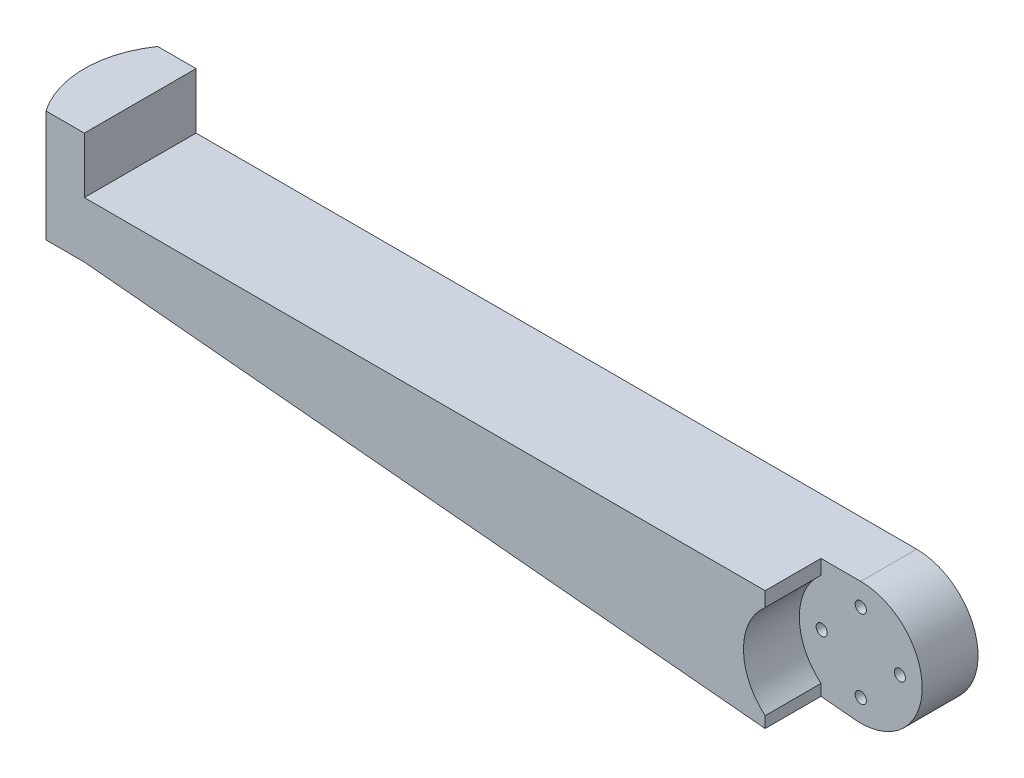
ISO-10303-21;
HEADER;
FILE_DESCRIPTION(('STEP AP214'),'2;1');
FILE_NAME('part.step','',(''),(''),'','','');
FILE_SCHEMA(('AUTOMOTIVE_DESIGN { 1 0 10303 214 1 1 1 1 }'));
ENDSEC;
DATA;
#1=APPLICATION_CONTEXT('core data for automotive mechanical design processes');
#2=APPLICATION_PROTOCOL_DEFINITION('international standard','automotive_design',2000,#1);
#3=PRODUCT_CONTEXT('',#1,'mechanical');
#4=PRODUCT('Part','Part','',(#3));
#5=PRODUCT_RELATED_PRODUCT_CATEGORY('part','',(#4));
#6=PRODUCT_DEFINITION_FORMATION('','',#4);
#7=PRODUCT_DEFINITION_CONTEXT('part definition',#1,'design');
#8=PRODUCT_DEFINITION('design','',#6,#7);
#9=PRODUCT_DEFINITION_SHAPE('','',#8);
#10=(LENGTH_UNIT() NAMED_UNIT(*) SI_UNIT(.MILLI.,.METRE.));
#11=(NAMED_UNIT(*) PLANE_ANGLE_UNIT() SI_UNIT($,.RADIAN.));
#12=(NAMED_UNIT(*) SI_UNIT($,.STERADIAN.) SOLID_ANGLE_UNIT());
#13=UNCERTAINTY_MEASURE_WITH_UNIT(LENGTH_MEASURE(1.E-05),#10,'distance_accuracy_value','');
#14=(GEOMETRIC_REPRESENTATION_CONTEXT(3) GLOBAL_UNCERTAINTY_ASSIGNED_CONTEXT((#13)) GLOBAL_UNIT_ASSIGNED_CONTEXT((#10,
#11,#12)) REPRESENTATION_CONTEXT('',''));
#15=CARTESIAN_POINT('',(0.,0.,0.));
#16=DIRECTION('',(0.,0.,1.));
#17=DIRECTION('',(1.,0.,0.));
#18=AXIS2_PLACEMENT_3D('',#15,#16,#17);
#19=CARTESIAN_POINT('',(-139.,0.999999999999987,10.));
#20=DIRECTION('',(0.,-1.,0.));
#21=DIRECTION('',(0.,0.,1.));
#22=AXIS2_PLACEMENT_3D('',#19,#20,#21);
#23=PLANE('',#22);
#24=DIRECTION('',(1.,0.,0.));
#25=VECTOR('',#24,1.);
#26=CARTESIAN_POINT('',(-139.,0.999999999999987,-10.));
#27=LINE('',#26,#25);
#28=CARTESIAN_POINT('',(-135.861406616345,0.999999999999987,-10.));
#29=VERTEX_POINT('',#28);
#30=CARTESIAN_POINT('',(-129.,0.999999999999987,-10.));
#31=VERTEX_POINT('',#30);
#32=EDGE_CURVE('E136',#29,#31,#27,.T.);
#33=ORIENTED_EDGE('',*,*,#32,.T.);
#34=DIRECTION('',(0.,0.,-1.));
#35=VECTOR('',#34,1.);
#36=CARTESIAN_POINT('',(-129.,0.999999999999987,10.));
#37=LINE('',#36,#35);
#38=CARTESIAN_POINT('',(-129.,0.999999999999987,10.));
#39=VERTEX_POINT('',#38);
#40=EDGE_CURVE('E153',#39,#31,#37,.T.);
#41=ORIENTED_EDGE('',*,*,#40,.F.);
#42=DIRECTION('',(1.,0.,0.));
#43=VECTOR('',#42,1.);
#44=CARTESIAN_POINT('',(-139.,0.999999999999987,10.));
#45=LINE('',#44,#43);
#46=CARTESIAN_POINT('',(-135.861406616345,0.999999999999987,10.));
#47=VERTEX_POINT('',#46);
#48=EDGE_CURVE('E138',#47,#39,#45,.T.);
#49=ORIENTED_EDGE('',*,*,#48,.F.);
#50=CARTESIAN_POINT('',(-121.5,0.999999999999987,0.));
#51=DIRECTION('',(0.,1.,0.));
#52=DIRECTION('',(0.,0.,1.));
#53=AXIS2_PLACEMENT_3D('',#50,#51,#52);
#54=CIRCLE('',#53,17.5);
#55=EDGE_CURVE('E124',#29,#47,#54,.T.);
#56=ORIENTED_EDGE('',*,*,#55,.F.);
#57=EDGE_LOOP('',(#33,#41,#49,#56));
#58=FACE_BOUND('',#57,.T.);
#59=ADVANCED_FACE('F41',(#58),#23,.T.);
#60=CARTESIAN_POINT('',(-129.,21.,10.));
#61=DIRECTION('',(0.,1.,0.));
#62=DIRECTION('',(-1.,0.,0.));
#63=AXIS2_PLACEMENT_3D('',#60,#61,#62);
#64=PLANE('',#63);
#65=CARTESIAN_POINT('',(-121.5,21.,0.));
#66=DIRECTION('',(0.,1.,0.));
#67=DIRECTION('',(-1.,0.,0.));
#68=AXIS2_PLACEMENT_3D('',#65,#66,#67);
#69=CIRCLE('',#68,17.5);
#70=CARTESIAN_POINT('',(-135.861406616345,21.,-10.));
#71=VERTEX_POINT('',#70);
#72=CARTESIAN_POINT('',(-135.861406616345,21.,10.));
#73=VERTEX_POINT('',#72);
#74=EDGE_CURVE('E127',#71,#73,#69,.T.);
#75=ORIENTED_EDGE('',*,*,#74,.T.);
#76=DIRECTION('',(-1.,0.,0.));
#77=VECTOR('',#76,1.);
#78=CARTESIAN_POINT('',(-129.,21.,10.));
#79=LINE('',#78,#77);
#80=CARTESIAN_POINT('',(-129.,21.,10.));
#81=VERTEX_POINT('',#80);
#82=EDGE_CURVE('E242',#81,#73,#79,.T.);
#83=ORIENTED_EDGE('',*,*,#82,.F.);
#84=DIRECTION('',(0.,0.,-1.));
#85=VECTOR('',#84,1.);
#86=CARTESIAN_POINT('',(-129.,21.,10.));
#87=LINE('',#86,#85);
#88=CARTESIAN_POINT('',(-129.,21.,-10.));
#89=VERTEX_POINT('',#88);
#90=EDGE_CURVE('E156',#81,#89,#87,.T.);
#91=ORIENTED_EDGE('',*,*,#90,.T.);
#92=DIRECTION('',(-1.,0.,0.));
#93=VECTOR('',#92,1.);
#94=CARTESIAN_POINT('',(-129.,21.,-10.));
#95=LINE('',#94,#93);
#96=EDGE_CURVE('E145',#89,#71,#95,.T.);
#97=ORIENTED_EDGE('',*,*,#96,.T.);
#98=EDGE_LOOP('',(#75,#83,#91,#97));
#99=FACE_BOUND('',#98,.T.);
#100=ADVANCED_FACE('F254',(#99),#64,.T.);
#101=CARTESIAN_POINT('',(0.,0.,-10.));
#102=DIRECTION('',(0.,0.,-1.));
#103=DIRECTION('',(1.,0.,0.));
#104=AXIS2_PLACEMENT_3D('',#101,#102,#103);
#105=PLANE('',#104);
#106=CARTESIAN_POINT('',(0.,-7.,-10.));
#107=DIRECTION('',(0.,0.,1.));
#108=DIRECTION('',(1.,0.,0.));
#109=AXIS2_PLACEMENT_3D('',#106,#107,#108);
#110=CIRCLE('',#109,1.);
#111=CARTESIAN_POINT('',(0.999999999999951,-7.,-10.));
#112=VERTEX_POINT('',#111);
#113=EDGE_CURVE('E168',#112,#112,#110,.T.);
#114=ORIENTED_EDGE('',*,*,#113,.T.);
#115=EDGE_LOOP('',(#114));
#116=FACE_BOUND('',#115,.T.);
#117=CARTESIAN_POINT('',(0.,7.,-10.));
#118=DIRECTION('',(0.,0.,1.));
#119=DIRECTION('',(1.,0.,0.));
#120=AXIS2_PLACEMENT_3D('',#117,#118,#119);
#121=CIRCLE('',#120,1.);
#122=CARTESIAN_POINT('',(1.,7.,-10.));
#123=VERTEX_POINT('',#122);
#124=EDGE_CURVE('E180',#123,#123,#121,.T.);
#125=ORIENTED_EDGE('',*,*,#124,.T.);
#126=EDGE_LOOP('',(#125));
#127=FACE_BOUND('',#126,.T.);
#128=CARTESIAN_POINT('',(7.,0.,-10.));
#129=DIRECTION('',(0.,0.,1.));
#130=DIRECTION('',(1.,0.,0.));
#131=AXIS2_PLACEMENT_3D('',#128,#129,#130);
#132=CIRCLE('',#131,1.);
#133=CARTESIAN_POINT('',(8.,0.,-10.));
#134=VERTEX_POINT('',#133);
#135=EDGE_CURVE('E174',#134,#134,#132,.T.);
#136=ORIENTED_EDGE('',*,*,#135,.T.);
#137=EDGE_LOOP('',(#136));
#138=FACE_BOUND('',#137,.T.);
#139=CARTESIAN_POINT('',(-7.,0.,-10.));
#140=DIRECTION('',(0.,0.,1.));
#141=DIRECTION('',(1.,0.,0.));
#142=AXIS2_PLACEMENT_3D('',#139,#140,#141);
#143=CIRCLE('',#142,1.);
#144=CARTESIAN_POINT('',(-6.,0.,-10.));
#145=VERTEX_POINT('',#144);
#146=EDGE_CURVE('E162',#145,#145,#143,.T.);
#147=ORIENTED_EDGE('',*,*,#146,.T.);
#148=EDGE_LOOP('',(#147));
#149=FACE_BOUND('',#148,.T.);
#150=ORIENTED_EDGE('',*,*,#96,.F.);
#151=DIRECTION('',(0.,1.,0.));
#152=VECTOR('',#151,1.);
#153=CARTESIAN_POINT('',(-129.,11.,-10.));
#154=LINE('',#153,#152);
#155=CARTESIAN_POINT('',(-129.,11.,-10.));
#156=VERTEX_POINT('',#155);
#157=EDGE_CURVE('E149',#156,#89,#154,.T.);
#158=ORIENTED_EDGE('',*,*,#157,.F.);
#159=DIRECTION('',(-1.,0.,0.));
#160=VECTOR('',#159,1.);
#161=CARTESIAN_POINT('',(0.,11.,-10.));
#162=LINE('',#161,#160);
#163=CARTESIAN_POINT('',(0.,11.,-10.));
#164=VERTEX_POINT('',#163);
#165=EDGE_CURVE('E228',#164,#156,#162,.T.);
#166=ORIENTED_EDGE('',*,*,#165,.F.);
#167=CARTESIAN_POINT('',(0.,0.,-10.));
#168=DIRECTION('',(0.,0.,1.));
#169=DIRECTION('',(1.,0.,0.));
#170=AXIS2_PLACEMENT_3D('',#167,#168,#169);
#171=CIRCLE('',#170,11.);
#172=CARTESIAN_POINT('',(-1.02288633962367,-10.9523378114543,-10.));
#173=VERTEX_POINT('',#172);
#174=EDGE_CURVE('E186',#173,#164,#171,.T.);
#175=ORIENTED_EDGE('',*,*,#174,.F.);
#176=DIRECTION('',(0.995667073768571,-0.092989667238516,0.));
#177=VECTOR('',#176,1.);
#178=CARTESIAN_POINT('',(-129.,0.999999999999987,-10.));
#179=LINE('',#178,#177);
#180=EDGE_CURVE('E143',#31,#173,#179,.T.);
#181=ORIENTED_EDGE('',*,*,#180,.F.);
#182=ORIENTED_EDGE('',*,*,#32,.F.);
#183=DIRECTION('',(0.,1.,0.));
#184=VECTOR('',#183,1.);
#185=CARTESIAN_POINT('',(-135.861406616345,-9.48097173109072,-10.));
#186=LINE('',#185,#184);
#187=EDGE_CURVE('E121',#29,#71,#186,.T.);
#188=ORIENTED_EDGE('',*,*,#187,.T.);
#189=EDGE_LOOP('',(#150,#158,#166,#175,#181,#182,#188));
#190=FACE_BOUND('',#189,.T.);
#191=ADVANCED_FACE('F140',(#116,#127,#138,#149,#190),#105,.T.);
#192=CARTESIAN_POINT('',(0.,0.,0.));
#193=DIRECTION('',(0.,0.,-1.));
#194=DIRECTION('',(1.,0.,0.));
#195=AXIS2_PLACEMENT_3D('',#192,#193,#194);
#196=PLANE('',#195);
#197=CARTESIAN_POINT('',(0.,0.,0.));
#198=DIRECTION('',(0.,0.,1.));
#199=DIRECTION('',(1.,0.,0.));
#200=AXIS2_PLACEMENT_3D('',#197,#198,#199);
#201=CIRCLE('',#200,11.);
#202=CARTESIAN_POINT('',(-7.12256812039605,8.38266206943343,0.));
#203=VERTEX_POINT('',#202);
#204=CARTESIAN_POINT('',(-7.12256812039605,-8.38266206943343,0.));
#205=VERTEX_POINT('',#204);
#206=EDGE_CURVE('E189',#203,#205,#201,.T.);
#207=ORIENTED_EDGE('',*,*,#206,.T.);
#208=DIRECTION('',(0.,1.,0.));
#209=VECTOR('',#208,1.);
#210=CARTESIAN_POINT('',(-7.12256812039605,-8.38266206943343,0.));
#211=LINE('',#210,#209);
#212=CARTESIAN_POINT('',(-7.12256812039605,-10.3826620694334,0.));
#213=VERTEX_POINT('',#212);
#214=EDGE_CURVE('E216',#213,#205,#211,.T.);
#215=ORIENTED_EDGE('',*,*,#214,.F.);
#216=DIRECTION('',(-0.995667073768572,0.0929896672385145,0.));
#217=VECTOR('',#216,1.);
#218=CARTESIAN_POINT('',(-1.02288633962367,-10.9523378114543,0.));
#219=LINE('',#218,#217);
#220=CARTESIAN_POINT('',(-1.02288633962367,-10.9523378114543,0.));
#221=VERTEX_POINT('',#220);
#222=EDGE_CURVE('E214',#221,#213,#219,.T.);
#223=ORIENTED_EDGE('',*,*,#222,.F.);
#224=CARTESIAN_POINT('',(0.,11.,0.));
#225=VERTEX_POINT('',#224);
#226=EDGE_CURVE('E183',#221,#225,#201,.T.);
#227=ORIENTED_EDGE('',*,*,#226,.T.);
#228=DIRECTION('',(1.,0.,0.));
#229=VECTOR('',#228,1.);
#230=CARTESIAN_POINT('',(0.,11.,0.));
#231=LINE('',#230,#229);
#232=CARTESIAN_POINT('',(-7.12256812039605,11.,0.));
#233=VERTEX_POINT('',#232);
#234=EDGE_CURVE('E200',#233,#225,#231,.T.);
#235=ORIENTED_EDGE('',*,*,#234,.F.);
#236=DIRECTION('',(0.,1.,0.));
#237=VECTOR('',#236,1.);
#238=CARTESIAN_POINT('',(-7.12256812039605,11.,0.));
#239=LINE('',#238,#237);
#240=EDGE_CURVE('E232',#203,#233,#239,.T.);
#241=ORIENTED_EDGE('',*,*,#240,.F.);
#242=EDGE_LOOP('',(#207,#215,#223,#227,#235,#241));
#243=FACE_BOUND('',#242,.T.);
#244=CARTESIAN_POINT('',(0.,7.,0.));
#245=DIRECTION('',(0.,0.,1.));
#246=DIRECTION('',(1.,0.,0.));
#247=AXIS2_PLACEMENT_3D('',#244,#245,#246);
#248=CIRCLE('',#247,1.);
#249=CARTESIAN_POINT('',(1.,7.,0.));
#250=VERTEX_POINT('',#249);
#251=EDGE_CURVE('E177',#250,#250,#248,.T.);
#252=ORIENTED_EDGE('',*,*,#251,.F.);
#253=EDGE_LOOP('',(#252));
#254=FACE_BOUND('',#253,.T.);
#255=CARTESIAN_POINT('',(7.,0.,0.));
#256=DIRECTION('',(0.,0.,1.));
#257=DIRECTION('',(1.,0.,0.));
#258=AXIS2_PLACEMENT_3D('',#255,#256,#257);
#259=CIRCLE('',#258,1.);
#260=CARTESIAN_POINT('',(8.,0.,0.));
#261=VERTEX_POINT('',#260);
#262=EDGE_CURVE('E171',#261,#261,#259,.T.);
#263=ORIENTED_EDGE('',*,*,#262,.F.);
#264=EDGE_LOOP('',(#263));
#265=FACE_BOUND('',#264,.T.);
#266=CARTESIAN_POINT('',(0.,-7.,0.));
#267=DIRECTION('',(0.,0.,1.));
#268=DIRECTION('',(1.,0.,0.));
#269=AXIS2_PLACEMENT_3D('',#266,#267,#268);
#270=CIRCLE('',#269,1.);
#271=CARTESIAN_POINT('',(0.999999999999951,-7.,0.));
#272=VERTEX_POINT('',#271);
#273=EDGE_CURVE('E165',#272,#272,#270,.T.);
#274=ORIENTED_EDGE('',*,*,#273,.F.);
#275=EDGE_LOOP('',(#274));
#276=FACE_BOUND('',#275,.T.);
#277=CARTESIAN_POINT('',(-7.,0.,0.));
#278=DIRECTION('',(0.,0.,1.));
#279=DIRECTION('',(1.,0.,0.));
#280=AXIS2_PLACEMENT_3D('',#277,#278,#279);
#281=CIRCLE('',#280,1.);
#282=CARTESIAN_POINT('',(-6.,0.,0.));
#283=VERTEX_POINT('',#282);
#284=EDGE_CURVE('E155',#283,#283,#281,.T.);
#285=ORIENTED_EDGE('',*,*,#284,.F.);
#286=EDGE_LOOP('',(#285));
#287=FACE_BOUND('',#286,.T.);
#288=ADVANCED_FACE('F210',(#243,#254,#265,#276,#287),#196,.F.);
#289=CARTESIAN_POINT('',(0.,0.,-10.));
#290=DIRECTION('',(0.,0.,1.));
#291=DIRECTION('',(-1.,0.,0.));
#292=AXIS2_PLACEMENT_3D('',#289,#290,#291);
#293=CYLINDRICAL_SURFACE('',#292,11.);
#294=ORIENTED_EDGE('',*,*,#174,.T.);
#295=DIRECTION('',(0.,0.,1.));
#296=VECTOR('',#295,1.);
#297=CARTESIAN_POINT('',(0.,11.,-10.));
#298=LINE('',#297,#296);
#299=EDGE_CURVE('E49',#164,#225,#298,.T.);
#300=ORIENTED_EDGE('',*,*,#299,.T.);
#301=ORIENTED_EDGE('',*,*,#226,.F.);
#302=DIRECTION('',(0.,0.,1.));
#303=VECTOR('',#302,1.);
#304=CARTESIAN_POINT('',(-1.02288633962368,-10.9523378114543,-10.));
#305=LINE('',#304,#303);
#306=EDGE_CURVE('E11',#173,#221,#305,.T.);
#307=ORIENTED_EDGE('',*,*,#306,.F.);
#308=EDGE_LOOP('',(#294,#300,#301,#307));
#309=FACE_BOUND('',#308,.T.);
#310=ADVANCED_FACE('F43',(#309),#293,.T.);
#311=CARTESIAN_POINT('',(0.,7.,-10.));
#312=DIRECTION('',(0.,0.,1.));
#313=DIRECTION('',(-1.,0.,0.));
#314=AXIS2_PLACEMENT_3D('',#311,#312,#313);
#315=CYLINDRICAL_SURFACE('',#314,1.);
#316=ORIENTED_EDGE('',*,*,#124,.F.);
#317=EDGE_LOOP('',(#316));
#318=FACE_BOUND('',#317,.T.);
#319=ORIENTED_EDGE('',*,*,#251,.T.);
#320=EDGE_LOOP('',(#319));
#321=FACE_BOUND('',#320,.T.);
#322=ADVANCED_FACE('F294',(#318,#321),#315,.F.);
#323=CARTESIAN_POINT('',(7.,0.,-10.));
#324=DIRECTION('',(0.,0.,1.));
#325=DIRECTION('',(-1.,0.,0.));
#326=AXIS2_PLACEMENT_3D('',#323,#324,#325);
#327=CYLINDRICAL_SURFACE('',#326,1.);
#328=ORIENTED_EDGE('',*,*,#135,.F.);
#329=EDGE_LOOP('',(#328));
#330=FACE_BOUND('',#329,.T.);
#331=ORIENTED_EDGE('',*,*,#262,.T.);
#332=EDGE_LOOP('',(#331));
#333=FACE_BOUND('',#332,.T.);
#334=ADVANCED_FACE('F290',(#330,#333),#327,.F.);
#335=CARTESIAN_POINT('',(0.,-7.,-10.));
#336=DIRECTION('',(0.,0.,1.));
#337=DIRECTION('',(-1.,0.,0.));
#338=AXIS2_PLACEMENT_3D('',#335,#336,#337);
#339=CYLINDRICAL_SURFACE('',#338,1.);
#340=ORIENTED_EDGE('',*,*,#113,.F.);
#341=EDGE_LOOP('',(#340));
#342=FACE_BOUND('',#341,.T.);
#343=ORIENTED_EDGE('',*,*,#273,.T.);
#344=EDGE_LOOP('',(#343));
#345=FACE_BOUND('',#344,.T.);
#346=ADVANCED_FACE('F286',(#342,#345),#339,.F.);
#347=CARTESIAN_POINT('',(-7.,0.,-10.));
#348=DIRECTION('',(0.,0.,1.));
#349=DIRECTION('',(-1.,0.,0.));
#350=AXIS2_PLACEMENT_3D('',#347,#348,#349);
#351=CYLINDRICAL_SURFACE('',#350,1.);
#352=ORIENTED_EDGE('',*,*,#146,.F.);
#353=EDGE_LOOP('',(#352));
#354=FACE_BOUND('',#353,.T.);
#355=ORIENTED_EDGE('',*,*,#284,.T.);
#356=EDGE_LOOP('',(#355));
#357=FACE_BOUND('',#356,.T.);
#358=ADVANCED_FACE('F272',(#354,#357),#351,.F.);
#359=CARTESIAN_POINT('',(0.,0.,10.));
#360=DIRECTION('',(0.,0.,-1.));
#361=DIRECTION('',(1.,0.,0.));
#362=AXIS2_PLACEMENT_3D('',#359,#360,#361);
#363=CYLINDRICAL_SURFACE('',#362,11.);
#364=DIRECTION('',(0.,0.,1.));
#365=VECTOR('',#364,1.);
#366=CARTESIAN_POINT('',(-7.12256812039605,-8.38266206943343,-7.58824317431015));
#367=LINE('',#366,#365);
#368=CARTESIAN_POINT('',(-7.12256812039605,-8.38266206943343,10.));
#369=VERTEX_POINT('',#368);
#370=EDGE_CURVE('E227',#205,#369,#367,.T.);
#371=ORIENTED_EDGE('',*,*,#370,.F.);
#372=ORIENTED_EDGE('',*,*,#206,.F.);
#373=DIRECTION('',(0.,0.,1.));
#374=VECTOR('',#373,1.);
#375=CARTESIAN_POINT('',(-7.12256812039605,8.38266206943343,-7.58824317431015));
#376=LINE('',#375,#374);
#377=CARTESIAN_POINT('',(-7.12256812039605,8.38266206943343,10.));
#378=VERTEX_POINT('',#377);
#379=EDGE_CURVE('E208',#203,#378,#376,.T.);
#380=ORIENTED_EDGE('',*,*,#379,.T.);
#381=CARTESIAN_POINT('',(0.,0.,10.));
#382=DIRECTION('',(0.,0.,-1.));
#383=DIRECTION('',(1.,0.,0.));
#384=AXIS2_PLACEMENT_3D('',#381,#382,#383);
#385=CIRCLE('',#384,11.);
#386=EDGE_CURVE('E147',#369,#378,#385,.T.);
#387=ORIENTED_EDGE('',*,*,#386,.F.);
#388=EDGE_LOOP('',(#371,#372,#380,#387));
#389=FACE_BOUND('',#388,.T.);
#390=ADVANCED_FACE('F262',(#389),#363,.F.);
#391=CARTESIAN_POINT('',(-129.,0.999999999999987,10.));
#392=DIRECTION('',(-0.092989667238516,-0.995667073768572,0.));
#393=DIRECTION('',(0.995667073768572,-0.092989667238516,0.));
#394=AXIS2_PLACEMENT_3D('',#391,#392,#393);
#395=PLANE('',#394);
#396=ORIENTED_EDGE('',*,*,#222,.T.);
#397=DIRECTION('',(0.,0.,1.));
#398=VECTOR('',#397,1.);
#399=CARTESIAN_POINT('',(-7.12256812039605,-10.3826620694334,-7.58824317431015));
#400=LINE('',#399,#398);
#401=CARTESIAN_POINT('',(-7.12256812039605,-10.3826620694334,10.));
#402=VERTEX_POINT('',#401);
#403=EDGE_CURVE('E219',#213,#402,#400,.T.);
#404=ORIENTED_EDGE('',*,*,#403,.T.);
#405=DIRECTION('',(0.995667073768571,-0.092989667238516,0.));
#406=VECTOR('',#405,1.);
#407=CARTESIAN_POINT('',(-129.,0.999999999999987,10.));
#408=LINE('',#407,#406);
#409=EDGE_CURVE('E161',#39,#402,#408,.T.);
#410=ORIENTED_EDGE('',*,*,#409,.F.);
#411=ORIENTED_EDGE('',*,*,#40,.T.);
#412=ORIENTED_EDGE('',*,*,#180,.T.);
#413=ORIENTED_EDGE('',*,*,#306,.T.);
#414=EDGE_LOOP('',(#396,#404,#410,#411,#412,#413));
#415=FACE_BOUND('',#414,.T.);
#416=ADVANCED_FACE('F264',(#415),#395,.T.);
#417=CARTESIAN_POINT('',(-129.,11.,10.));
#418=DIRECTION('',(1.,0.,0.));
#419=DIRECTION('',(0.,0.,1.));
#420=AXIS2_PLACEMENT_3D('',#417,#418,#419);
#421=PLANE('',#420);
#422=ORIENTED_EDGE('',*,*,#157,.T.);
#423=ORIENTED_EDGE('',*,*,#90,.F.);
#424=DIRECTION('',(0.,1.,0.));
#425=VECTOR('',#424,1.);
#426=CARTESIAN_POINT('',(-129.,11.,10.));
#427=LINE('',#426,#425);
#428=CARTESIAN_POINT('',(-129.,11.,10.));
#429=VERTEX_POINT('',#428);
#430=EDGE_CURVE('E240',#429,#81,#427,.T.);
#431=ORIENTED_EDGE('',*,*,#430,.F.);
#432=DIRECTION('',(0.,0.,-1.));
#433=VECTOR('',#432,1.);
#434=CARTESIAN_POINT('',(-129.,11.,10.));
#435=LINE('',#434,#433);
#436=EDGE_CURVE('E159',#429,#156,#435,.T.);
#437=ORIENTED_EDGE('',*,*,#436,.T.);
#438=EDGE_LOOP('',(#422,#423,#431,#437));
#439=FACE_BOUND('',#438,.T.);
#440=ADVANCED_FACE('F249',(#439),#421,.T.);
#441=CARTESIAN_POINT('',(0.,11.,10.));
#442=DIRECTION('',(0.,1.,0.));
#443=DIRECTION('',(-1.,0.,0.));
#444=AXIS2_PLACEMENT_3D('',#441,#442,#443);
#445=PLANE('',#444);
#446=ORIENTED_EDGE('',*,*,#234,.T.);
#447=ORIENTED_EDGE('',*,*,#299,.F.);
#448=ORIENTED_EDGE('',*,*,#165,.T.);
#449=ORIENTED_EDGE('',*,*,#436,.F.);
#450=DIRECTION('',(-1.,0.,0.));
#451=VECTOR('',#450,1.);
#452=CARTESIAN_POINT('',(0.,11.,10.));
#453=LINE('',#452,#451);
#454=CARTESIAN_POINT('',(-7.12256812039605,11.,10.));
#455=VERTEX_POINT('',#454);
#456=EDGE_CURVE('E238',#455,#429,#453,.T.);
#457=ORIENTED_EDGE('',*,*,#456,.F.);
#458=DIRECTION('',(0.,0.,1.));
#459=VECTOR('',#458,1.);
#460=CARTESIAN_POINT('',(-7.12256812039605,11.,-7.58824317431015));
#461=LINE('',#460,#459);
#462=EDGE_CURVE('E204',#233,#455,#461,.T.);
#463=ORIENTED_EDGE('',*,*,#462,.F.);
#464=EDGE_LOOP('',(#446,#447,#448,#449,#457,#463));
#465=FACE_BOUND('',#464,.T.);
#466=ADVANCED_FACE('F201',(#465),#445,.T.);
#467=CARTESIAN_POINT('',(0.,0.,10.));
#468=DIRECTION('',(0.,0.,-1.));
#469=DIRECTION('',(1.,0.,0.));
#470=AXIS2_PLACEMENT_3D('',#467,#468,#469);
#471=PLANE('',#470);
#472=ORIENTED_EDGE('',*,*,#48,.T.);
#473=ORIENTED_EDGE('',*,*,#409,.T.);
#474=DIRECTION('',(0.,1.,0.));
#475=VECTOR('',#474,1.);
#476=CARTESIAN_POINT('',(-7.12256812039605,-8.38266206943343,10.));
#477=LINE('',#476,#475);
#478=EDGE_CURVE('E64',#402,#369,#477,.T.);
#479=ORIENTED_EDGE('',*,*,#478,.T.);
#480=ORIENTED_EDGE('',*,*,#386,.T.);
#481=DIRECTION('',(0.,1.,0.));
#482=VECTOR('',#481,1.);
#483=CARTESIAN_POINT('',(-7.12256812039605,11.,10.));
#484=LINE('',#483,#482);
#485=EDGE_CURVE('E222',#378,#455,#484,.T.);
#486=ORIENTED_EDGE('',*,*,#485,.T.);
#487=ORIENTED_EDGE('',*,*,#456,.T.);
#488=ORIENTED_EDGE('',*,*,#430,.T.);
#489=ORIENTED_EDGE('',*,*,#82,.T.);
#490=DIRECTION('',(0.,1.,0.));
#491=VECTOR('',#490,1.);
#492=CARTESIAN_POINT('',(-135.861406616345,-9.48097173109072,10.));
#493=LINE('',#492,#491);
#494=EDGE_CURVE('E56',#47,#73,#493,.T.);
#495=ORIENTED_EDGE('',*,*,#494,.F.);
#496=EDGE_LOOP('',(#472,#473,#479,#480,#486,#487,#488,#489,#495));
#497=FACE_BOUND('',#496,.T.);
#498=ADVANCED_FACE('F256',(#497),#471,.F.);
#499=CARTESIAN_POINT('',(-7.12256812039605,11.,-7.58824317431015));
#500=DIRECTION('',(-1.,0.,0.));
#501=DIRECTION('',(0.,-1.,0.));
#502=AXIS2_PLACEMENT_3D('',#499,#500,#501);
#503=PLANE('',#502);
#504=ORIENTED_EDGE('',*,*,#379,.F.);
#505=ORIENTED_EDGE('',*,*,#240,.T.);
#506=ORIENTED_EDGE('',*,*,#462,.T.);
#507=ORIENTED_EDGE('',*,*,#485,.F.);
#508=EDGE_LOOP('',(#504,#505,#506,#507));
#509=FACE_BOUND('',#508,.T.);
#510=ADVANCED_FACE('F259',(#509),#503,.F.);
#511=CARTESIAN_POINT('',(-7.12256812039605,-8.38266206943343,-7.58824317431015));
#512=DIRECTION('',(-1.,0.,0.));
#513=DIRECTION('',(0.,0.,-1.));
#514=AXIS2_PLACEMENT_3D('',#511,#512,#513);
#515=PLANE('',#514);
#516=ORIENTED_EDGE('',*,*,#403,.F.);
#517=ORIENTED_EDGE('',*,*,#214,.T.);
#518=ORIENTED_EDGE('',*,*,#370,.T.);
#519=ORIENTED_EDGE('',*,*,#478,.F.);
#520=EDGE_LOOP('',(#516,#517,#518,#519));
#521=FACE_BOUND('',#520,.T.);
#522=ADVANCED_FACE('F263',(#521),#515,.F.);
#523=CARTESIAN_POINT('',(-121.5,-9.48097173109073,0.));
#524=DIRECTION('',(0.,1.,0.));
#525=DIRECTION('',(-1.,0.,0.));
#526=AXIS2_PLACEMENT_3D('',#523,#524,#525);
#527=CYLINDRICAL_SURFACE('',#526,17.5);
#528=ORIENTED_EDGE('',*,*,#55,.T.);
#529=ORIENTED_EDGE('',*,*,#494,.T.);
#530=ORIENTED_EDGE('',*,*,#74,.F.);
#531=ORIENTED_EDGE('',*,*,#187,.F.);
#532=EDGE_LOOP('',(#528,#529,#530,#531));
#533=FACE_BOUND('',#532,.T.);
#534=ADVANCED_FACE('F123',(#533),#527,.T.);
#535=CLOSED_SHELL('',(#59,#100,#191,#288,#310,#322,#334,#346,#358,#390,#416,#440,#466,#498,#510,
#522,#534));
#536=MANIFOLD_SOLID_BREP('B2',#535);
#537=ADVANCED_BREP_SHAPE_REPRESENTATION('',(#18,#536),#14);
#538=SHAPE_DEFINITION_REPRESENTATION(#9,#537);
ENDSEC;
END-ISO-10303-21;
